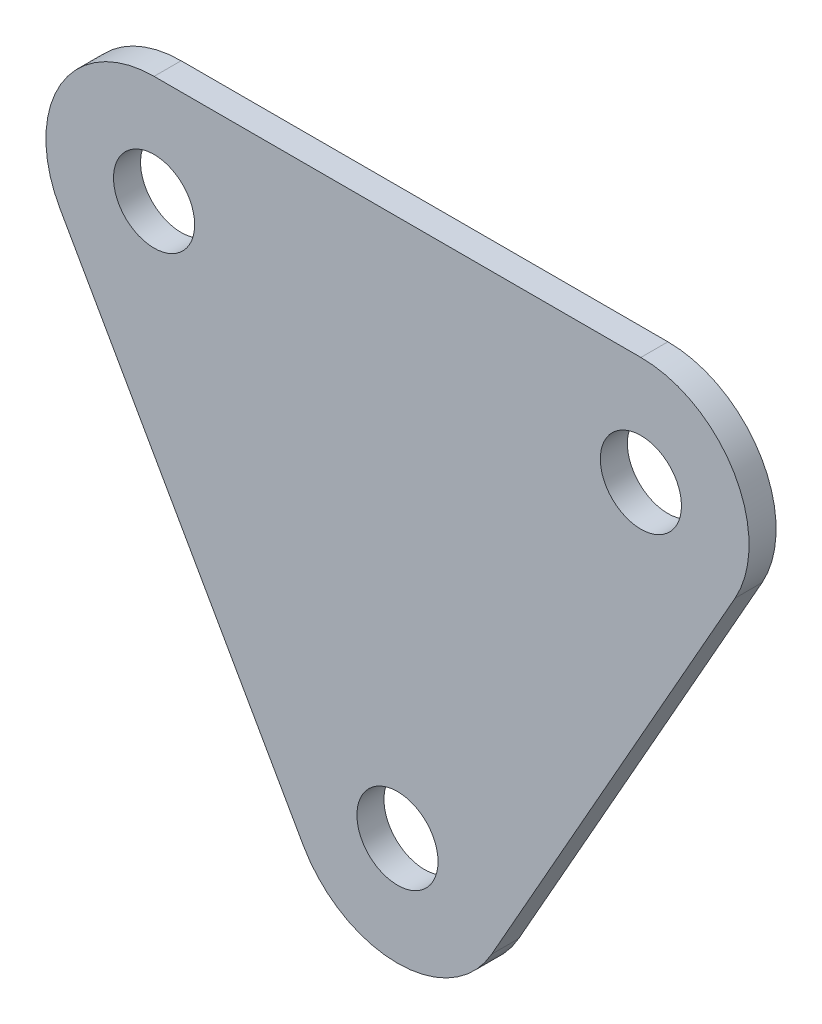
ISO-10303-21;
HEADER;
FILE_DESCRIPTION(('STEP AP214'),'2;1');
FILE_NAME('part.step','',(''),(''),'','','');
FILE_SCHEMA(('AUTOMOTIVE_DESIGN { 1 0 10303 214 1 1 1 1 }'));
ENDSEC;
DATA;
#1=APPLICATION_CONTEXT('core data for automotive mechanical design processes');
#2=APPLICATION_PROTOCOL_DEFINITION('international standard','automotive_design',2000,#1);
#3=PRODUCT_CONTEXT('',#1,'mechanical');
#4=PRODUCT('Part','Part','',(#3));
#5=PRODUCT_RELATED_PRODUCT_CATEGORY('part','',(#4));
#6=PRODUCT_DEFINITION_FORMATION('','',#4);
#7=PRODUCT_DEFINITION_CONTEXT('part definition',#1,'design');
#8=PRODUCT_DEFINITION('design','',#6,#7);
#9=PRODUCT_DEFINITION_SHAPE('','',#8);
#10=(LENGTH_UNIT() NAMED_UNIT(*) SI_UNIT(.MILLI.,.METRE.));
#11=(NAMED_UNIT(*) PLANE_ANGLE_UNIT() SI_UNIT($,.RADIAN.));
#12=(NAMED_UNIT(*) SI_UNIT($,.STERADIAN.) SOLID_ANGLE_UNIT());
#13=UNCERTAINTY_MEASURE_WITH_UNIT(LENGTH_MEASURE(1.E-05),#10,'distance_accuracy_value','');
#14=(GEOMETRIC_REPRESENTATION_CONTEXT(3) GLOBAL_UNCERTAINTY_ASSIGNED_CONTEXT((#13)) GLOBAL_UNIT_ASSIGNED_CONTEXT((#10,
#11,#12)) REPRESENTATION_CONTEXT('',''));
#15=CARTESIAN_POINT('',(0.,0.,0.));
#16=DIRECTION('',(0.,0.,1.));
#17=DIRECTION('',(1.,0.,0.));
#18=AXIS2_PLACEMENT_3D('',#15,#16,#17);
#19=CARTESIAN_POINT('',(0.,0.,20.));
#20=DIRECTION('',(0.,0.,1.));
#21=DIRECTION('',(1.,0.,0.));
#22=AXIS2_PLACEMENT_3D('',#19,#20,#21);
#23=PLANE('',#22);
#24=CARTESIAN_POINT('',(360.,0.,20.));
#25=DIRECTION('',(0.,0.,1.));
#26=DIRECTION('',(1.,0.,0.));
#27=AXIS2_PLACEMENT_3D('',#24,#25,#26);
#28=CIRCLE('',#27,30.);
#29=CARTESIAN_POINT('',(390.,0.,20.));
#30=VERTEX_POINT('',#29);
#31=EDGE_CURVE('E211',#30,#30,#28,.T.);
#32=ORIENTED_EDGE('',*,*,#31,.F.);
#33=EDGE_LOOP('',(#32));
#34=FACE_BOUND('',#33,.T.);
#35=CARTESIAN_POINT('',(0.,0.,20.));
#36=DIRECTION('',(0.,0.,1.));
#37=DIRECTION('',(1.,0.,0.));
#38=AXIS2_PLACEMENT_3D('',#35,#36,#37);
#39=CIRCLE('',#38,80.0000000000092);
#40=CARTESIAN_POINT('',(0.,80.,20.));
#41=VERTEX_POINT('',#40);
#42=CARTESIAN_POINT('',(-69.6205484057294,-39.4078575881564,20.));
#43=VERTEX_POINT('',#42);
#44=EDGE_CURVE('E150',#41,#43,#39,.T.);
#45=ORIENTED_EDGE('',*,*,#44,.T.);
#46=DIRECTION('',(0.492598219851842,-0.870256855071419,0.));
#47=VECTOR('',#46,1.);
#48=CARTESIAN_POINT('',(-69.6205484057294,-39.4078575881564,20.));
#49=LINE('',#48,#47);
#50=CARTESIAN_POINT('',(110.379451594293,-357.407857588135,20.));
#51=VERTEX_POINT('',#50);
#52=EDGE_CURVE('E98',#43,#51,#49,.T.);
#53=ORIENTED_EDGE('',*,*,#52,.T.);
#54=CARTESIAN_POINT('',(180.000000000007,-317.999999999988,20.));
#55=DIRECTION('',(0.,0.,1.));
#56=DIRECTION('',(1.,0.,0.));
#57=AXIS2_PLACEMENT_3D('',#54,#55,#56);
#58=CIRCLE('',#57,80.);
#59=CARTESIAN_POINT('',(249.620548405724,-357.407857588129,20.));
#60=VERTEX_POINT('',#59);
#61=EDGE_CURVE('E111',#51,#60,#58,.T.);
#62=ORIENTED_EDGE('',*,*,#61,.T.);
#63=DIRECTION('',(0.49259821985177,0.87025685507146,0.));
#64=VECTOR('',#63,1.);
#65=CARTESIAN_POINT('',(429.620548405715,-39.4078575881439,20.));
#66=LINE('',#65,#64);
#67=CARTESIAN_POINT('',(429.620548405715,-39.4078575881439,20.));
#68=VERTEX_POINT('',#67);
#69=EDGE_CURVE('E105',#60,#68,#66,.T.);
#70=ORIENTED_EDGE('',*,*,#69,.T.);
#71=CARTESIAN_POINT('',(360.,0.,20.));
#72=DIRECTION('',(0.,0.,1.));
#73=DIRECTION('',(1.,0.,0.));
#74=AXIS2_PLACEMENT_3D('',#71,#72,#73);
#75=CIRCLE('',#74,80.);
#76=CARTESIAN_POINT('',(360.,80.,20.));
#77=VERTEX_POINT('',#76);
#78=EDGE_CURVE('E109',#68,#77,#75,.T.);
#79=ORIENTED_EDGE('',*,*,#78,.T.);
#80=DIRECTION('',(-1.,0.,0.));
#81=VECTOR('',#80,1.);
#82=CARTESIAN_POINT('',(0.,80.,20.));
#83=LINE('',#82,#81);
#84=EDGE_CURVE('E61',#77,#41,#83,.T.);
#85=ORIENTED_EDGE('',*,*,#84,.T.);
#86=EDGE_LOOP('',(#45,#53,#62,#70,#79,#85));
#87=FACE_BOUND('',#86,.T.);
#88=CARTESIAN_POINT('',(0.,0.,20.));
#89=DIRECTION('',(0.,0.,1.));
#90=DIRECTION('',(1.,0.,0.));
#91=AXIS2_PLACEMENT_3D('',#88,#89,#90);
#92=CIRCLE('',#91,30.);
#93=CARTESIAN_POINT('',(30.,0.,20.));
#94=VERTEX_POINT('',#93);
#95=EDGE_CURVE('E138',#94,#94,#92,.T.);
#96=ORIENTED_EDGE('',*,*,#95,.F.);
#97=EDGE_LOOP('',(#96));
#98=FACE_BOUND('',#97,.T.);
#99=CARTESIAN_POINT('',(180.000000000007,-317.999999999988,20.));
#100=DIRECTION('',(0.,0.,1.));
#101=DIRECTION('',(1.,0.,0.));
#102=AXIS2_PLACEMENT_3D('',#99,#100,#101);
#103=CIRCLE('',#102,30.);
#104=CARTESIAN_POINT('',(210.000000000007,-317.999999999988,20.));
#105=VERTEX_POINT('',#104);
#106=EDGE_CURVE('E200',#105,#105,#103,.T.);
#107=ORIENTED_EDGE('',*,*,#106,.F.);
#108=EDGE_LOOP('',(#107));
#109=FACE_BOUND('',#108,.T.);
#110=ADVANCED_FACE('F43',(#34,#87,#98,#109),#23,.T.);
#111=CARTESIAN_POINT('',(0.,0.,0.));
#112=DIRECTION('',(0.,0.,1.));
#113=DIRECTION('',(1.,0.,0.));
#114=AXIS2_PLACEMENT_3D('',#111,#112,#113);
#115=PLANE('',#114);
#116=CARTESIAN_POINT('',(0.,0.,0.));
#117=DIRECTION('',(0.,0.,1.));
#118=DIRECTION('',(1.,0.,0.));
#119=AXIS2_PLACEMENT_3D('',#116,#117,#118);
#120=CIRCLE('',#119,80.0000000000092);
#121=CARTESIAN_POINT('',(0.,80.,0.));
#122=VERTEX_POINT('',#121);
#123=CARTESIAN_POINT('',(-69.6205484057294,-39.4078575881564,0.));
#124=VERTEX_POINT('',#123);
#125=EDGE_CURVE('E133',#122,#124,#120,.T.);
#126=ORIENTED_EDGE('',*,*,#125,.F.);
#127=DIRECTION('',(-1.,0.,0.));
#128=VECTOR('',#127,1.);
#129=CARTESIAN_POINT('',(0.,80.,0.));
#130=LINE('',#129,#128);
#131=CARTESIAN_POINT('',(360.,80.,0.));
#132=VERTEX_POINT('',#131);
#133=EDGE_CURVE('E90',#132,#122,#130,.T.);
#134=ORIENTED_EDGE('',*,*,#133,.F.);
#135=CARTESIAN_POINT('',(360.,0.,0.));
#136=DIRECTION('',(0.,0.,1.));
#137=DIRECTION('',(1.,0.,0.));
#138=AXIS2_PLACEMENT_3D('',#135,#136,#137);
#139=CIRCLE('',#138,80.);
#140=CARTESIAN_POINT('',(429.620548405715,-39.4078575881439,0.));
#141=VERTEX_POINT('',#140);
#142=EDGE_CURVE('E84',#141,#132,#139,.T.);
#143=ORIENTED_EDGE('',*,*,#142,.F.);
#144=DIRECTION('',(0.49259821985177,0.87025685507146,0.));
#145=VECTOR('',#144,1.);
#146=CARTESIAN_POINT('',(429.620548405715,-39.4078575881439,0.));
#147=LINE('',#146,#145);
#148=CARTESIAN_POINT('',(249.620548405724,-357.407857588129,0.));
#149=VERTEX_POINT('',#148);
#150=EDGE_CURVE('E120',#149,#141,#147,.T.);
#151=ORIENTED_EDGE('',*,*,#150,.F.);
#152=CARTESIAN_POINT('',(180.000000000007,-317.999999999988,0.));
#153=DIRECTION('',(0.,0.,1.));
#154=DIRECTION('',(1.,0.,0.));
#155=AXIS2_PLACEMENT_3D('',#152,#153,#154);
#156=CIRCLE('',#155,80.);
#157=CARTESIAN_POINT('',(110.379451594293,-357.407857588135,0.));
#158=VERTEX_POINT('',#157);
#159=EDGE_CURVE('E141',#158,#149,#156,.T.);
#160=ORIENTED_EDGE('',*,*,#159,.F.);
#161=DIRECTION('',(0.492598219851842,-0.870256855071419,0.));
#162=VECTOR('',#161,1.);
#163=CARTESIAN_POINT('',(-69.6205484057294,-39.4078575881564,0.));
#164=LINE('',#163,#162);
#165=EDGE_CURVE('E137',#124,#158,#164,.T.);
#166=ORIENTED_EDGE('',*,*,#165,.F.);
#167=EDGE_LOOP('',(#126,#134,#143,#151,#160,#166));
#168=FACE_BOUND('',#167,.T.);
#169=CARTESIAN_POINT('',(0.,0.,0.));
#170=DIRECTION('',(0.,0.,1.));
#171=DIRECTION('',(1.,0.,0.));
#172=AXIS2_PLACEMENT_3D('',#169,#170,#171);
#173=CIRCLE('',#172,30.);
#174=CARTESIAN_POINT('',(30.,0.,0.));
#175=VERTEX_POINT('',#174);
#176=EDGE_CURVE('E215',#175,#175,#173,.T.);
#177=ORIENTED_EDGE('',*,*,#176,.T.);
#178=EDGE_LOOP('',(#177));
#179=FACE_BOUND('',#178,.T.);
#180=CARTESIAN_POINT('',(360.,0.,0.));
#181=DIRECTION('',(0.,0.,1.));
#182=DIRECTION('',(1.,0.,0.));
#183=AXIS2_PLACEMENT_3D('',#180,#181,#182);
#184=CIRCLE('',#183,30.);
#185=CARTESIAN_POINT('',(390.,0.,0.));
#186=VERTEX_POINT('',#185);
#187=EDGE_CURVE('E208',#186,#186,#184,.T.);
#188=ORIENTED_EDGE('',*,*,#187,.T.);
#189=EDGE_LOOP('',(#188));
#190=FACE_BOUND('',#189,.T.);
#191=CARTESIAN_POINT('',(180.000000000007,-317.999999999988,0.));
#192=DIRECTION('',(0.,0.,1.));
#193=DIRECTION('',(1.,0.,0.));
#194=AXIS2_PLACEMENT_3D('',#191,#192,#193);
#195=CIRCLE('',#194,30.);
#196=CARTESIAN_POINT('',(210.000000000007,-317.999999999988,0.));
#197=VERTEX_POINT('',#196);
#198=EDGE_CURVE('E203',#197,#197,#195,.T.);
#199=ORIENTED_EDGE('',*,*,#198,.T.);
#200=EDGE_LOOP('',(#199));
#201=FACE_BOUND('',#200,.T.);
#202=ADVANCED_FACE('F163',(#168,#179,#190,#201),#115,.F.);
#203=CARTESIAN_POINT('',(0.,0.,20.));
#204=DIRECTION('',(0.,0.,-1.));
#205=DIRECTION('',(-1.,0.,0.));
#206=AXIS2_PLACEMENT_3D('',#203,#204,#205);
#207=CYLINDRICAL_SURFACE('',#206,80.0000000000092);
#208=ORIENTED_EDGE('',*,*,#125,.T.);
#209=DIRECTION('',(0.,0.,-1.));
#210=VECTOR('',#209,1.);
#211=CARTESIAN_POINT('',(-69.6205484057294,-39.4078575881564,20.));
#212=LINE('',#211,#210);
#213=EDGE_CURVE('E11',#43,#124,#212,.T.);
#214=ORIENTED_EDGE('',*,*,#213,.F.);
#215=ORIENTED_EDGE('',*,*,#44,.F.);
#216=DIRECTION('',(0.,0.,-1.));
#217=VECTOR('',#216,1.);
#218=CARTESIAN_POINT('',(0.,80.,20.));
#219=LINE('',#218,#217);
#220=EDGE_CURVE('E129',#41,#122,#219,.T.);
#221=ORIENTED_EDGE('',*,*,#220,.T.);
#222=EDGE_LOOP('',(#208,#214,#215,#221));
#223=FACE_BOUND('',#222,.T.);
#224=ADVANCED_FACE('F45',(#223),#207,.T.);
#225=CARTESIAN_POINT('',(-69.6205484057294,-39.4078575881564,20.));
#226=DIRECTION('',(0.870256855071419,0.492598219851842,0.));
#227=DIRECTION('',(-0.492598219851842,0.870256855071419,0.));
#228=AXIS2_PLACEMENT_3D('',#225,#226,#227);
#229=PLANE('',#228);
#230=ORIENTED_EDGE('',*,*,#165,.T.);
#231=DIRECTION('',(0.,0.,-1.));
#232=VECTOR('',#231,1.);
#233=CARTESIAN_POINT('',(110.379451594293,-357.407857588135,20.));
#234=LINE('',#233,#232);
#235=EDGE_CURVE('E53',#51,#158,#234,.T.);
#236=ORIENTED_EDGE('',*,*,#235,.F.);
#237=ORIENTED_EDGE('',*,*,#52,.F.);
#238=ORIENTED_EDGE('',*,*,#213,.T.);
#239=EDGE_LOOP('',(#230,#236,#237,#238));
#240=FACE_BOUND('',#239,.T.);
#241=ADVANCED_FACE('F275',(#240),#229,.F.);
#242=CARTESIAN_POINT('',(180.000000000007,-317.999999999988,20.));
#243=DIRECTION('',(0.,0.,-1.));
#244=DIRECTION('',(-1.,0.,0.));
#245=AXIS2_PLACEMENT_3D('',#242,#243,#244);
#246=CYLINDRICAL_SURFACE('',#245,80.);
#247=ORIENTED_EDGE('',*,*,#159,.T.);
#248=DIRECTION('',(0.,0.,-1.));
#249=VECTOR('',#248,1.);
#250=CARTESIAN_POINT('',(249.620548405724,-357.407857588129,20.));
#251=LINE('',#250,#249);
#252=EDGE_CURVE('E122',#60,#149,#251,.T.);
#253=ORIENTED_EDGE('',*,*,#252,.F.);
#254=ORIENTED_EDGE('',*,*,#61,.F.);
#255=ORIENTED_EDGE('',*,*,#235,.T.);
#256=EDGE_LOOP('',(#247,#253,#254,#255));
#257=FACE_BOUND('',#256,.T.);
#258=ADVANCED_FACE('F160',(#257),#246,.T.);
#259=CARTESIAN_POINT('',(429.620548405715,-39.4078575881439,20.));
#260=DIRECTION('',(-0.87025685507146,0.49259821985177,0.));
#261=DIRECTION('',(-0.49259821985177,-0.87025685507146,0.));
#262=AXIS2_PLACEMENT_3D('',#259,#260,#261);
#263=PLANE('',#262);
#264=ORIENTED_EDGE('',*,*,#150,.T.);
#265=DIRECTION('',(0.,0.,-1.));
#266=VECTOR('',#265,1.);
#267=CARTESIAN_POINT('',(429.620548405715,-39.4078575881439,20.));
#268=LINE('',#267,#266);
#269=EDGE_CURVE('E117',#68,#141,#268,.T.);
#270=ORIENTED_EDGE('',*,*,#269,.F.);
#271=ORIENTED_EDGE('',*,*,#69,.F.);
#272=ORIENTED_EDGE('',*,*,#252,.T.);
#273=EDGE_LOOP('',(#264,#270,#271,#272));
#274=FACE_BOUND('',#273,.T.);
#275=ADVANCED_FACE('F118',(#274),#263,.F.);
#276=CARTESIAN_POINT('',(360.,0.,20.));
#277=DIRECTION('',(0.,0.,-1.));
#278=DIRECTION('',(-1.,0.,0.));
#279=AXIS2_PLACEMENT_3D('',#276,#277,#278);
#280=CYLINDRICAL_SURFACE('',#279,80.);
#281=ORIENTED_EDGE('',*,*,#142,.T.);
#282=DIRECTION('',(0.,0.,-1.));
#283=VECTOR('',#282,1.);
#284=CARTESIAN_POINT('',(360.,80.,20.));
#285=LINE('',#284,#283);
#286=EDGE_CURVE('E123',#77,#132,#285,.T.);
#287=ORIENTED_EDGE('',*,*,#286,.F.);
#288=ORIENTED_EDGE('',*,*,#78,.F.);
#289=ORIENTED_EDGE('',*,*,#269,.T.);
#290=EDGE_LOOP('',(#281,#287,#288,#289));
#291=FACE_BOUND('',#290,.T.);
#292=ADVANCED_FACE('F125',(#291),#280,.T.);
#293=CARTESIAN_POINT('',(0.,80.,20.));
#294=DIRECTION('',(0.,-1.,0.));
#295=DIRECTION('',(0.,0.,-1.));
#296=AXIS2_PLACEMENT_3D('',#293,#294,#295);
#297=PLANE('',#296);
#298=ORIENTED_EDGE('',*,*,#133,.T.);
#299=ORIENTED_EDGE('',*,*,#220,.F.);
#300=ORIENTED_EDGE('',*,*,#84,.F.);
#301=ORIENTED_EDGE('',*,*,#286,.T.);
#302=EDGE_LOOP('',(#298,#299,#300,#301));
#303=FACE_BOUND('',#302,.T.);
#304=ADVANCED_FACE('F168',(#303),#297,.F.);
#305=CARTESIAN_POINT('',(0.,0.,20.));
#306=DIRECTION('',(0.,0.,-1.));
#307=DIRECTION('',(-1.,0.,0.));
#308=AXIS2_PLACEMENT_3D('',#305,#306,#307);
#309=CYLINDRICAL_SURFACE('',#308,30.);
#310=ORIENTED_EDGE('',*,*,#95,.T.);
#311=EDGE_LOOP('',(#310));
#312=FACE_BOUND('',#311,.T.);
#313=ORIENTED_EDGE('',*,*,#176,.F.);
#314=EDGE_LOOP('',(#313));
#315=FACE_BOUND('',#314,.T.);
#316=ADVANCED_FACE('F170',(#312,#315),#309,.F.);
#317=CARTESIAN_POINT('',(360.,0.,20.));
#318=DIRECTION('',(0.,0.,-1.));
#319=DIRECTION('',(-1.,0.,0.));
#320=AXIS2_PLACEMENT_3D('',#317,#318,#319);
#321=CYLINDRICAL_SURFACE('',#320,30.);
#322=ORIENTED_EDGE('',*,*,#31,.T.);
#323=EDGE_LOOP('',(#322));
#324=FACE_BOUND('',#323,.T.);
#325=ORIENTED_EDGE('',*,*,#187,.F.);
#326=EDGE_LOOP('',(#325));
#327=FACE_BOUND('',#326,.T.);
#328=ADVANCED_FACE('F176',(#324,#327),#321,.F.);
#329=CARTESIAN_POINT('',(180.000000000007,-317.999999999988,20.));
#330=DIRECTION('',(0.,0.,-1.));
#331=DIRECTION('',(-1.,0.,0.));
#332=AXIS2_PLACEMENT_3D('',#329,#330,#331);
#333=CYLINDRICAL_SURFACE('',#332,30.);
#334=ORIENTED_EDGE('',*,*,#106,.T.);
#335=EDGE_LOOP('',(#334));
#336=FACE_BOUND('',#335,.T.);
#337=ORIENTED_EDGE('',*,*,#198,.F.);
#338=EDGE_LOOP('',(#337));
#339=FACE_BOUND('',#338,.T.);
#340=ADVANCED_FACE('F191',(#336,#339),#333,.F.);
#341=CLOSED_SHELL('',(#110,#202,#224,#241,#258,#275,#292,#304,#316,#328,#340));
#342=MANIFOLD_SOLID_BREP('B2',#341);
#343=ADVANCED_BREP_SHAPE_REPRESENTATION('',(#18,#342),#14);
#344=SHAPE_DEFINITION_REPRESENTATION(#9,#343);
ENDSEC;
END-ISO-10303-21;
